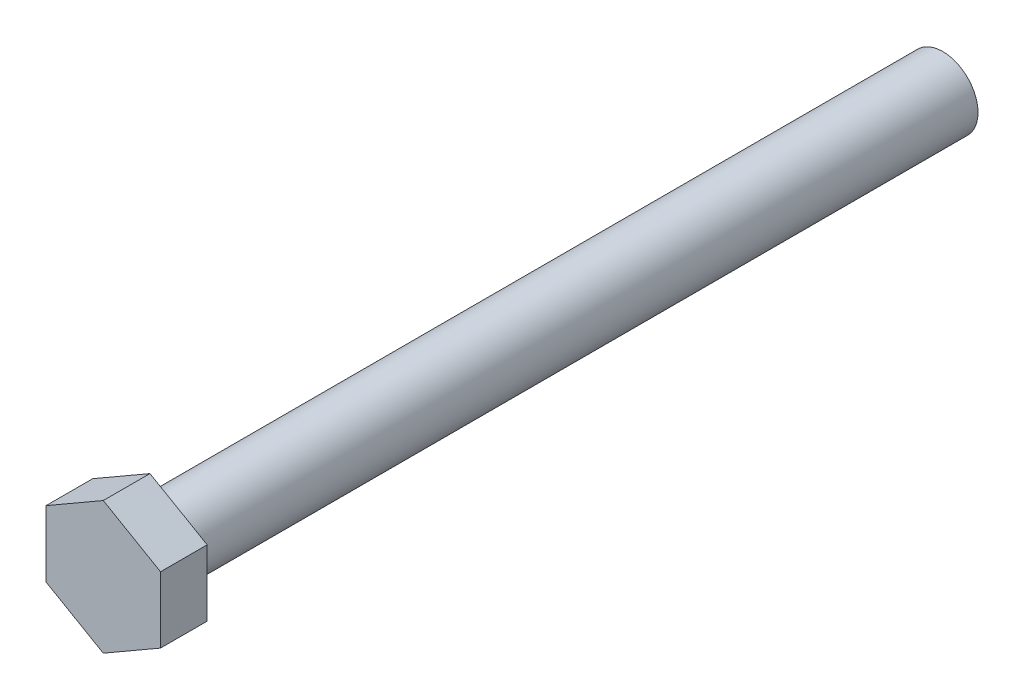
ISO-10303-21;
HEADER;
FILE_DESCRIPTION(('STEP AP214'),'2;1');
FILE_NAME('part.step','',(''),(''),'','','');
FILE_SCHEMA(('AUTOMOTIVE_DESIGN { 1 0 10303 214 1 1 1 1 }'));
ENDSEC;
DATA;
#1=APPLICATION_CONTEXT('core data for automotive mechanical design processes');
#2=APPLICATION_PROTOCOL_DEFINITION('international standard','automotive_design',2000,#1);
#3=PRODUCT_CONTEXT('',#1,'mechanical');
#4=PRODUCT('Part','Part','',(#3));
#5=PRODUCT_RELATED_PRODUCT_CATEGORY('part','',(#4));
#6=PRODUCT_DEFINITION_FORMATION('','',#4);
#7=PRODUCT_DEFINITION_CONTEXT('part definition',#1,'design');
#8=PRODUCT_DEFINITION('design','',#6,#7);
#9=PRODUCT_DEFINITION_SHAPE('','',#8);
#10=(LENGTH_UNIT() NAMED_UNIT(*) SI_UNIT(.MILLI.,.METRE.));
#11=(NAMED_UNIT(*) PLANE_ANGLE_UNIT() SI_UNIT($,.RADIAN.));
#12=(NAMED_UNIT(*) SI_UNIT($,.STERADIAN.) SOLID_ANGLE_UNIT());
#13=UNCERTAINTY_MEASURE_WITH_UNIT(LENGTH_MEASURE(1.E-05),#10,'distance_accuracy_value','');
#14=(GEOMETRIC_REPRESENTATION_CONTEXT(3) GLOBAL_UNCERTAINTY_ASSIGNED_CONTEXT((#13)) GLOBAL_UNIT_ASSIGNED_CONTEXT((#10,
#11,#12)) REPRESENTATION_CONTEXT('',''));
#15=CARTESIAN_POINT('',(0.,0.,0.));
#16=DIRECTION('',(0.,0.,1.));
#17=DIRECTION('',(1.,0.,0.));
#18=AXIS2_PLACEMENT_3D('',#15,#16,#17);
#19=CARTESIAN_POINT('',(6.49999999999996,3.75277674973265,5.3));
#20=DIRECTION('',(-0.499999999999995,-0.866025403784442,0.));
#21=DIRECTION('',(0.866025403784442,-0.499999999999995,0.));
#22=AXIS2_PLACEMENT_3D('',#19,#20,#21);
#23=PLANE('',#22);
#24=DIRECTION('',(-0.866025403784441,0.499999999999995,0.));
#25=VECTOR('',#24,1.);
#26=CARTESIAN_POINT('',(6.49999999999996,3.75277674973265,0.));
#27=LINE('',#26,#25);
#28=CARTESIAN_POINT('',(6.49999999999996,3.75277674973265,0.));
#29=VERTEX_POINT('',#28);
#30=CARTESIAN_POINT('',(0.,7.50555349946514,0.));
#31=VERTEX_POINT('',#30);
#32=EDGE_CURVE('E121',#29,#31,#27,.T.);
#33=ORIENTED_EDGE('',*,*,#32,.T.);
#34=DIRECTION('',(0.,0.,-1.));
#35=VECTOR('',#34,1.);
#36=CARTESIAN_POINT('',(0.,7.50555349946514,5.3));
#37=LINE('',#36,#35);
#38=CARTESIAN_POINT('',(0.,7.50555349946514,5.3));
#39=VERTEX_POINT('',#38);
#40=EDGE_CURVE('E38',#39,#31,#37,.T.);
#41=ORIENTED_EDGE('',*,*,#40,.F.);
#42=DIRECTION('',(-0.866025403784441,0.499999999999995,0.));
#43=VECTOR('',#42,1.);
#44=CARTESIAN_POINT('',(6.49999999999996,3.75277674973265,5.3));
#45=LINE('',#44,#43);
#46=CARTESIAN_POINT('',(6.49999999999996,3.75277674973265,5.3));
#47=VERTEX_POINT('',#46);
#48=EDGE_CURVE('E132',#47,#39,#45,.T.);
#49=ORIENTED_EDGE('',*,*,#48,.F.);
#50=DIRECTION('',(0.,0.,-1.));
#51=VECTOR('',#50,1.);
#52=CARTESIAN_POINT('',(6.49999999999996,3.75277674973265,5.3));
#53=LINE('',#52,#51);
#54=EDGE_CURVE('E117',#47,#29,#53,.T.);
#55=ORIENTED_EDGE('',*,*,#54,.T.);
#56=EDGE_LOOP('',(#33,#41,#49,#55));
#57=FACE_BOUND('',#56,.T.);
#58=ADVANCED_FACE('F35',(#57),#23,.F.);
#59=CARTESIAN_POINT('',(0.,7.50555349946514,5.3));
#60=DIRECTION('',(0.500000000000001,-0.866025403784438,0.));
#61=DIRECTION('',(0.866025403784438,0.500000000000001,0.));
#62=AXIS2_PLACEMENT_3D('',#59,#60,#61);
#63=PLANE('',#62);
#64=DIRECTION('',(-0.866025403784438,-0.500000000000001,0.));
#65=VECTOR('',#64,1.);
#66=CARTESIAN_POINT('',(0.,7.50555349946514,0.));
#67=LINE('',#66,#65);
#68=CARTESIAN_POINT('',(-6.50000000000001,3.75277674973256,0.));
#69=VERTEX_POINT('',#68);
#70=EDGE_CURVE('E124',#31,#69,#67,.T.);
#71=ORIENTED_EDGE('',*,*,#70,.T.);
#72=DIRECTION('',(0.,0.,-1.));
#73=VECTOR('',#72,1.);
#74=CARTESIAN_POINT('',(-6.50000000000001,3.75277674973256,5.3));
#75=LINE('',#74,#73);
#76=CARTESIAN_POINT('',(-6.50000000000001,3.75277674973256,5.3));
#77=VERTEX_POINT('',#76);
#78=EDGE_CURVE('E135',#77,#69,#75,.T.);
#79=ORIENTED_EDGE('',*,*,#78,.F.);
#80=DIRECTION('',(-0.866025403784438,-0.500000000000001,0.));
#81=VECTOR('',#80,1.);
#82=CARTESIAN_POINT('',(0.,7.50555349946514,5.3));
#83=LINE('',#82,#81);
#84=EDGE_CURVE('E90',#39,#77,#83,.T.);
#85=ORIENTED_EDGE('',*,*,#84,.F.);
#86=ORIENTED_EDGE('',*,*,#40,.T.);
#87=EDGE_LOOP('',(#71,#79,#85,#86));
#88=FACE_BOUND('',#87,.T.);
#89=ADVANCED_FACE('F140',(#88),#63,.F.);
#90=CARTESIAN_POINT('',(-6.50000000000001,3.75277674973256,5.3));
#91=DIRECTION('',(1.,0.,0.));
#92=DIRECTION('',(0.,1.,0.));
#93=AXIS2_PLACEMENT_3D('',#90,#91,#92);
#94=PLANE('',#93);
#95=DIRECTION('',(0.,-1.,0.));
#96=VECTOR('',#95,1.);
#97=CARTESIAN_POINT('',(-6.50000000000001,3.75277674973256,0.));
#98=LINE('',#97,#96);
#99=CARTESIAN_POINT('',(-6.49999999999999,-3.7527767497326,0.));
#100=VERTEX_POINT('',#99);
#101=EDGE_CURVE('E127',#69,#100,#98,.T.);
#102=ORIENTED_EDGE('',*,*,#101,.T.);
#103=DIRECTION('',(0.,0.,-1.));
#104=VECTOR('',#103,1.);
#105=CARTESIAN_POINT('',(-6.49999999999999,-3.7527767497326,5.3));
#106=LINE('',#105,#104);
#107=CARTESIAN_POINT('',(-6.49999999999999,-3.7527767497326,5.3));
#108=VERTEX_POINT('',#107);
#109=EDGE_CURVE('E112',#108,#100,#106,.T.);
#110=ORIENTED_EDGE('',*,*,#109,.F.);
#111=DIRECTION('',(0.,-1.,0.));
#112=VECTOR('',#111,1.);
#113=CARTESIAN_POINT('',(-6.50000000000001,3.75277674973256,5.3));
#114=LINE('',#113,#112);
#115=EDGE_CURVE('E103',#77,#108,#114,.T.);
#116=ORIENTED_EDGE('',*,*,#115,.F.);
#117=ORIENTED_EDGE('',*,*,#78,.T.);
#118=EDGE_LOOP('',(#102,#110,#116,#117));
#119=FACE_BOUND('',#118,.T.);
#120=ADVANCED_FACE('F146',(#119),#94,.F.);
#121=CARTESIAN_POINT('',(-6.49999999999999,-3.7527767497326,5.3));
#122=DIRECTION('',(0.499999999999995,0.866025403784442,0.));
#123=DIRECTION('',(-0.866025403784442,0.499999999999995,0.));
#124=AXIS2_PLACEMENT_3D('',#121,#122,#123);
#125=PLANE('',#124);
#126=DIRECTION('',(0.866025403784441,-0.499999999999995,0.));
#127=VECTOR('',#126,1.);
#128=CARTESIAN_POINT('',(-6.49999999999999,-3.7527767497326,0.));
#129=LINE('',#128,#127);
#130=CARTESIAN_POINT('',(0.,-7.50555349946514,0.));
#131=VERTEX_POINT('',#130);
#132=EDGE_CURVE('E111',#100,#131,#129,.T.);
#133=ORIENTED_EDGE('',*,*,#132,.T.);
#134=DIRECTION('',(0.,0.,-1.));
#135=VECTOR('',#134,1.);
#136=CARTESIAN_POINT('',(0.,-7.50555349946514,5.3));
#137=LINE('',#136,#135);
#138=CARTESIAN_POINT('',(0.,-7.50555349946514,5.3));
#139=VERTEX_POINT('',#138);
#140=EDGE_CURVE('E108',#139,#131,#137,.T.);
#141=ORIENTED_EDGE('',*,*,#140,.F.);
#142=DIRECTION('',(0.866025403784441,-0.499999999999995,0.));
#143=VECTOR('',#142,1.);
#144=CARTESIAN_POINT('',(-6.49999999999999,-3.7527767497326,5.3));
#145=LINE('',#144,#143);
#146=EDGE_CURVE('E97',#108,#139,#145,.T.);
#147=ORIENTED_EDGE('',*,*,#146,.F.);
#148=ORIENTED_EDGE('',*,*,#109,.T.);
#149=EDGE_LOOP('',(#133,#141,#147,#148));
#150=FACE_BOUND('',#149,.T.);
#151=ADVANCED_FACE('F109',(#150),#125,.F.);
#152=CARTESIAN_POINT('',(0.,-7.50555349946514,5.3));
#153=DIRECTION('',(-0.500000000000007,0.866025403784435,0.));
#154=DIRECTION('',(-0.866025403784435,-0.500000000000007,0.));
#155=AXIS2_PLACEMENT_3D('',#152,#153,#154);
#156=PLANE('',#155);
#157=DIRECTION('',(0.866025403784435,0.500000000000007,0.));
#158=VECTOR('',#157,1.);
#159=CARTESIAN_POINT('',(0.,-7.50555349946514,0.));
#160=LINE('',#159,#158);
#161=CARTESIAN_POINT('',(6.50000000000004,-3.75277674973251,0.));
#162=VERTEX_POINT('',#161);
#163=EDGE_CURVE('E75',#131,#162,#160,.T.);
#164=ORIENTED_EDGE('',*,*,#163,.T.);
#165=DIRECTION('',(0.,0.,-1.));
#166=VECTOR('',#165,1.);
#167=CARTESIAN_POINT('',(6.50000000000004,-3.75277674973251,5.3));
#168=LINE('',#167,#166);
#169=CARTESIAN_POINT('',(6.50000000000004,-3.75277674973251,5.3));
#170=VERTEX_POINT('',#169);
#171=EDGE_CURVE('E113',#170,#162,#168,.T.);
#172=ORIENTED_EDGE('',*,*,#171,.F.);
#173=DIRECTION('',(0.866025403784435,0.500000000000007,0.));
#174=VECTOR('',#173,1.);
#175=CARTESIAN_POINT('',(0.,-7.50555349946514,5.3));
#176=LINE('',#175,#174);
#177=EDGE_CURVE('E101',#139,#170,#176,.T.);
#178=ORIENTED_EDGE('',*,*,#177,.F.);
#179=ORIENTED_EDGE('',*,*,#140,.T.);
#180=EDGE_LOOP('',(#164,#172,#178,#179));
#181=FACE_BOUND('',#180,.T.);
#182=ADVANCED_FACE('F115',(#181),#156,.F.);
#183=CARTESIAN_POINT('',(6.50000000000004,-3.75277674973251,5.3));
#184=DIRECTION('',(-1.,0.,0.));
#185=DIRECTION('',(0.,-1.,0.));
#186=AXIS2_PLACEMENT_3D('',#183,#184,#185);
#187=PLANE('',#186);
#188=DIRECTION('',(0.,1.,0.));
#189=VECTOR('',#188,1.);
#190=CARTESIAN_POINT('',(6.50000000000004,-3.75277674973251,0.));
#191=LINE('',#190,#189);
#192=EDGE_CURVE('E81',#162,#29,#191,.T.);
#193=ORIENTED_EDGE('',*,*,#192,.T.);
#194=ORIENTED_EDGE('',*,*,#54,.F.);
#195=DIRECTION('',(0.,1.,0.));
#196=VECTOR('',#195,1.);
#197=CARTESIAN_POINT('',(6.50000000000004,-3.75277674973251,5.3));
#198=LINE('',#197,#196);
#199=EDGE_CURVE('E52',#170,#47,#198,.T.);
#200=ORIENTED_EDGE('',*,*,#199,.F.);
#201=ORIENTED_EDGE('',*,*,#171,.T.);
#202=EDGE_LOOP('',(#193,#194,#200,#201));
#203=FACE_BOUND('',#202,.T.);
#204=ADVANCED_FACE('F166',(#203),#187,.F.);
#205=CARTESIAN_POINT('',(0.,0.,5.3));
#206=DIRECTION('',(0.,0.,1.));
#207=DIRECTION('',(1.,0.,0.));
#208=AXIS2_PLACEMENT_3D('',#205,#206,#207);
#209=PLANE('',#208);
#210=ORIENTED_EDGE('',*,*,#48,.T.);
#211=ORIENTED_EDGE('',*,*,#84,.T.);
#212=ORIENTED_EDGE('',*,*,#115,.T.);
#213=ORIENTED_EDGE('',*,*,#146,.T.);
#214=ORIENTED_EDGE('',*,*,#177,.T.);
#215=ORIENTED_EDGE('',*,*,#199,.T.);
#216=EDGE_LOOP('',(#210,#211,#212,#213,#214,#215));
#217=FACE_BOUND('',#216,.T.);
#218=ADVANCED_FACE('F99',(#217),#209,.T.);
#219=CARTESIAN_POINT('',(0.,0.,0.));
#220=DIRECTION('',(0.,0.,1.));
#221=DIRECTION('',(1.,0.,0.));
#222=AXIS2_PLACEMENT_3D('',#219,#220,#221);
#223=PLANE('',#222);
#224=CARTESIAN_POINT('',(0.,0.,0.));
#225=DIRECTION('',(0.,0.,-1.));
#226=DIRECTION('',(-1.,0.,0.));
#227=AXIS2_PLACEMENT_3D('',#224,#225,#226);
#228=CIRCLE('',#227,4.);
#229=CARTESIAN_POINT('',(4.,0.,0.));
#230=VERTEX_POINT('',#229);
#231=EDGE_CURVE('E11',#230,#230,#228,.T.);
#232=ORIENTED_EDGE('',*,*,#231,.F.);
#233=EDGE_LOOP('',(#232));
#234=FACE_BOUND('',#233,.T.);
#235=ORIENTED_EDGE('',*,*,#32,.F.);
#236=ORIENTED_EDGE('',*,*,#192,.F.);
#237=ORIENTED_EDGE('',*,*,#163,.F.);
#238=ORIENTED_EDGE('',*,*,#132,.F.);
#239=ORIENTED_EDGE('',*,*,#101,.F.);
#240=ORIENTED_EDGE('',*,*,#70,.F.);
#241=EDGE_LOOP('',(#235,#236,#237,#238,#239,#240));
#242=FACE_BOUND('',#241,.T.);
#243=ADVANCED_FACE('F145',(#234,#242),#223,.F.);
#244=CARTESIAN_POINT('',(0.,0.,-90.));
#245=DIRECTION('',(0.,0.,1.));
#246=DIRECTION('',(1.,0.,0.));
#247=AXIS2_PLACEMENT_3D('',#244,#245,#246);
#248=CYLINDRICAL_SURFACE('',#247,4.);
#249=CARTESIAN_POINT('',(0.,0.,-90.));
#250=DIRECTION('',(0.,0.,-1.));
#251=DIRECTION('',(-1.,0.,0.));
#252=AXIS2_PLACEMENT_3D('',#249,#250,#251);
#253=CIRCLE('',#252,4.);
#254=CARTESIAN_POINT('',(4.,0.,-90.));
#255=VERTEX_POINT('',#254);
#256=EDGE_CURVE('E125',#255,#255,#253,.T.);
#257=CARTESIAN_POINT('',(4.,0.,-90.));
#258=CARTESIAN_POINT('',(4.,0.,-89.0625));
#259=CARTESIAN_POINT('',(4.,0.,-88.125));
#260=CARTESIAN_POINT('',(4.,0.,-86.25));
#261=CARTESIAN_POINT('',(4.,0.,-85.3125));
#262=CARTESIAN_POINT('',(4.,0.,-83.4375));
#263=CARTESIAN_POINT('',(4.,0.,-82.5));
#264=CARTESIAN_POINT('',(4.,0.,-80.625));
#265=CARTESIAN_POINT('',(4.,0.,-79.6875));
#266=CARTESIAN_POINT('',(4.,0.,-77.8125));
#267=CARTESIAN_POINT('',(4.,0.,-76.875));
#268=CARTESIAN_POINT('',(4.,0.,-75.));
#269=CARTESIAN_POINT('',(4.,0.,-74.0625));
#270=CARTESIAN_POINT('',(4.,0.,-72.1875));
#271=CARTESIAN_POINT('',(4.,0.,-71.25));
#272=CARTESIAN_POINT('',(4.,0.,-69.375));
#273=CARTESIAN_POINT('',(4.,0.,-68.4375));
#274=CARTESIAN_POINT('',(4.,0.,-66.5625));
#275=CARTESIAN_POINT('',(4.,0.,-65.625));
#276=CARTESIAN_POINT('',(4.,0.,-63.75));
#277=CARTESIAN_POINT('',(4.,0.,-62.8125));
#278=CARTESIAN_POINT('',(4.,0.,-60.9375));
#279=CARTESIAN_POINT('',(4.,0.,-60.));
#280=CARTESIAN_POINT('',(4.,0.,-58.125));
#281=CARTESIAN_POINT('',(4.,0.,-57.1875));
#282=CARTESIAN_POINT('',(4.,0.,-55.3125));
#283=CARTESIAN_POINT('',(4.,0.,-54.375));
#284=CARTESIAN_POINT('',(4.,0.,-52.5));
#285=CARTESIAN_POINT('',(4.,0.,-51.5625));
#286=CARTESIAN_POINT('',(4.,0.,-49.6875));
#287=CARTESIAN_POINT('',(4.,0.,-48.75));
#288=CARTESIAN_POINT('',(4.,0.,-46.875));
#289=CARTESIAN_POINT('',(4.,0.,-45.9375));
#290=CARTESIAN_POINT('',(4.,0.,-44.0625));
#291=CARTESIAN_POINT('',(4.,0.,-43.125));
#292=CARTESIAN_POINT('',(4.,0.,-41.25));
#293=CARTESIAN_POINT('',(4.,0.,-40.3125));
#294=CARTESIAN_POINT('',(4.,0.,-38.4375));
#295=CARTESIAN_POINT('',(4.,0.,-37.5));
#296=CARTESIAN_POINT('',(4.,0.,-35.625));
#297=CARTESIAN_POINT('',(4.,0.,-34.6875));
#298=CARTESIAN_POINT('',(4.,0.,-32.8125));
#299=CARTESIAN_POINT('',(4.,0.,-31.875));
#300=CARTESIAN_POINT('',(4.,0.,-30.));
#301=CARTESIAN_POINT('',(4.,0.,-29.0625));
#302=CARTESIAN_POINT('',(4.,0.,-27.1875));
#303=CARTESIAN_POINT('',(4.,0.,-26.25));
#304=CARTESIAN_POINT('',(4.,0.,-24.375));
#305=CARTESIAN_POINT('',(4.,0.,-23.4375));
#306=CARTESIAN_POINT('',(4.,0.,-21.5625));
#307=CARTESIAN_POINT('',(4.,0.,-20.625));
#308=CARTESIAN_POINT('',(4.,0.,-18.75));
#309=CARTESIAN_POINT('',(4.,0.,-17.8125));
#310=CARTESIAN_POINT('',(4.,0.,-15.9375));
#311=CARTESIAN_POINT('',(4.,0.,-15.));
#312=CARTESIAN_POINT('',(4.,0.,-13.125));
#313=CARTESIAN_POINT('',(4.,0.,-12.1875));
#314=CARTESIAN_POINT('',(4.,0.,-10.3125));
#315=CARTESIAN_POINT('',(4.,0.,-9.37499999999999));
#316=CARTESIAN_POINT('',(4.,0.,-7.49999999999999));
#317=CARTESIAN_POINT('',(4.,0.,-6.56249999999999));
#318=CARTESIAN_POINT('',(4.,0.,-4.68749999999999));
#319=CARTESIAN_POINT('',(4.,0.,-3.74999999999998));
#320=CARTESIAN_POINT('',(4.,0.,-1.87499999999998));
#321=CARTESIAN_POINT('',(4.,0.,-0.937499999999986));
#322=CARTESIAN_POINT('',(4.,0.,0.));
#323=B_SPLINE_CURVE_WITH_KNOTS('',3,(#257,#258,#259,#260,#261,#262,#263,#264,#265,#266,#267,
#268,#269,#270,#271,#272,#273,#274,#275,#276,#277,#278,#279,#280,#281,#282,#283,#284,#285,#286,
#287,#288,#289,#290,#291,#292,#293,#294,#295,#296,#297,#298,#299,#300,#301,#302,#303,#304,#305,
#306,#307,#308,#309,#310,#311,#312,#313,#314,#315,#316,#317,#318,#319,#320,#321,#322),
.UNSPECIFIED.,.F.,.F.,(4,2,2,2,2,2,2,2,2,2,2,2,2,2,2,2,2,2,2,2,2,2,2,2,2,2,2,2,2,2,2,2,4),(0.,
2.8125,5.62499999999999,8.43749999999999,11.25,14.0625,16.875,19.6875,22.5,25.3125,28.125,
30.9375,33.75,36.5625,39.375,42.1875,45.,47.8125,50.625,53.4375,56.25,59.0625,61.875,64.6875,
67.5,70.3125,73.125,75.9375,78.75,81.5625,84.375,87.1875,90.),.UNSPECIFIED.);
#324=EDGE_CURVE('BSEAM155',#255,#230,#323,.T.);
#325=ORIENTED_EDGE('',*,*,#256,.F.);
#326=ORIENTED_EDGE('',*,*,#231,.T.);
#327=ORIENTED_EDGE('',*,*,#324,.T.);
#328=ORIENTED_EDGE('',*,*,#324,.F.);
#329=EDGE_LOOP('',(#325,#327,#326,#328));
#330=FACE_BOUND('',#329,.T.);
#331=ADVANCED_FACE('F155',(#330),#248,.T.);
#332=CARTESIAN_POINT('',(0.,0.,-90.));
#333=DIRECTION('',(0.,0.,-1.));
#334=DIRECTION('',(-1.,0.,0.));
#335=AXIS2_PLACEMENT_3D('',#332,#333,#334);
#336=PLANE('',#335);
#337=ORIENTED_EDGE('',*,*,#256,.T.);
#338=EDGE_LOOP('',(#337));
#339=FACE_BOUND('',#338,.T.);
#340=ADVANCED_FACE('F153',(#339),#336,.T.);
#341=CLOSED_SHELL('',(#58,#89,#120,#151,#182,#204,#218,#243,#331,#340));
#342=MANIFOLD_SOLID_BREP('B2',#341);
#343=ADVANCED_BREP_SHAPE_REPRESENTATION('',(#18,#342),#14);
#344=SHAPE_DEFINITION_REPRESENTATION(#9,#343);
ENDSEC;
END-ISO-10303-21;
